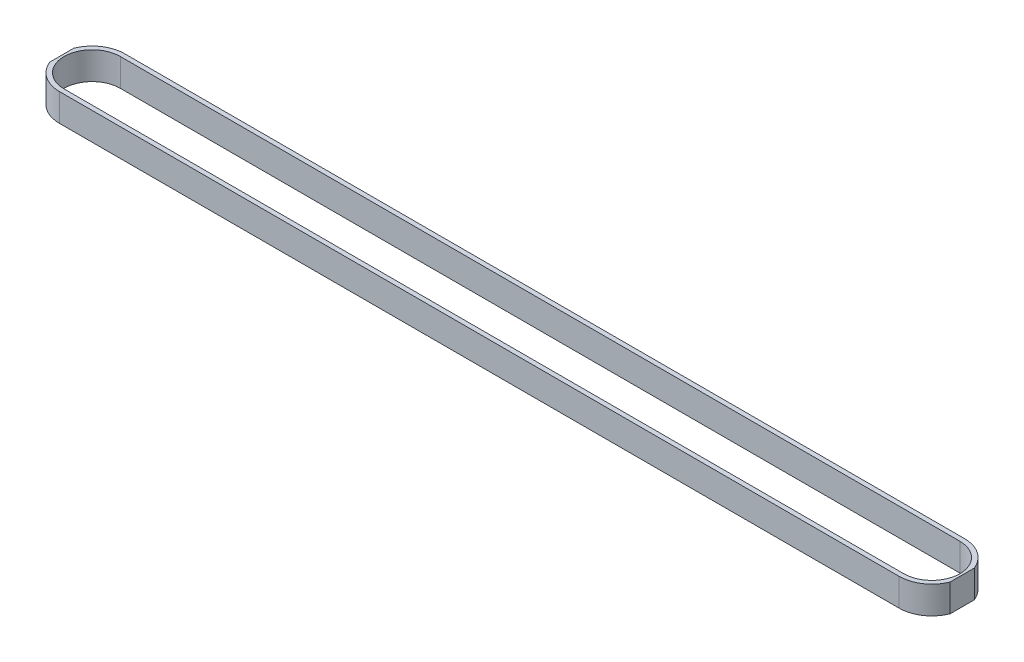
ISO-10303-21;
HEADER;
FILE_DESCRIPTION(('STEP AP214'),'2;1');
FILE_NAME('part.step','',(''),(''),'','','');
FILE_SCHEMA(('AUTOMOTIVE_DESIGN { 1 0 10303 214 1 1 1 1 }'));
ENDSEC;
DATA;
#1=APPLICATION_CONTEXT('core data for automotive mechanical design processes');
#2=APPLICATION_PROTOCOL_DEFINITION('international standard','automotive_design',2000,#1);
#3=PRODUCT_CONTEXT('',#1,'mechanical');
#4=PRODUCT('Part','Part','',(#3));
#5=PRODUCT_RELATED_PRODUCT_CATEGORY('part','',(#4));
#6=PRODUCT_DEFINITION_FORMATION('','',#4);
#7=PRODUCT_DEFINITION_CONTEXT('part definition',#1,'design');
#8=PRODUCT_DEFINITION('design','',#6,#7);
#9=PRODUCT_DEFINITION_SHAPE('','',#8);
#10=(LENGTH_UNIT() NAMED_UNIT(*) SI_UNIT(.MILLI.,.METRE.));
#11=(NAMED_UNIT(*) PLANE_ANGLE_UNIT() SI_UNIT($,.RADIAN.));
#12=(NAMED_UNIT(*) SI_UNIT($,.STERADIAN.) SOLID_ANGLE_UNIT());
#13=UNCERTAINTY_MEASURE_WITH_UNIT(LENGTH_MEASURE(1.E-05),#10,'distance_accuracy_value','');
#14=(GEOMETRIC_REPRESENTATION_CONTEXT(3) GLOBAL_UNCERTAINTY_ASSIGNED_CONTEXT((#13)) GLOBAL_UNIT_ASSIGNED_CONTEXT((#10,
#11,#12)) REPRESENTATION_CONTEXT('',''));
#15=CARTESIAN_POINT('',(0.,0.,0.));
#16=DIRECTION('',(0.,0.,1.));
#17=DIRECTION('',(1.,0.,0.));
#18=AXIS2_PLACEMENT_3D('',#15,#16,#17);
#19=CARTESIAN_POINT('',(0.,6.,0.));
#20=DIRECTION('',(0.,-1.,0.));
#21=DIRECTION('',(0.,0.,-1.));
#22=AXIS2_PLACEMENT_3D('',#19,#20,#21);
#23=CYLINDRICAL_SURFACE('',#22,7.11);
#24=CARTESIAN_POINT('',(0.,6.,0.));
#25=DIRECTION('',(0.,1.,0.));
#26=DIRECTION('',(0.,0.,1.));
#27=AXIS2_PLACEMENT_3D('',#24,#25,#26);
#28=CIRCLE('',#27,7.11);
#29=CARTESIAN_POINT('',(-6.61000000000003,6.,2.61916017074168));
#30=VERTEX_POINT('',#29);
#31=CARTESIAN_POINT('',(0.,6.,7.11));
#32=VERTEX_POINT('',#31);
#33=EDGE_CURVE('E187',#30,#32,#28,.T.);
#34=ORIENTED_EDGE('',*,*,#33,.F.);
#35=DIRECTION('',(0.,-1.,0.));
#36=VECTOR('',#35,1.);
#37=CARTESIAN_POINT('',(-6.61000000000003,6.,2.61916017074168));
#38=LINE('',#37,#36);
#39=CARTESIAN_POINT('',(-6.61000000000003,0.,2.61916017074168));
#40=VERTEX_POINT('',#39);
#41=EDGE_CURVE('E11',#30,#40,#38,.T.);
#42=ORIENTED_EDGE('',*,*,#41,.T.);
#43=CARTESIAN_POINT('',(0.,0.,0.));
#44=DIRECTION('',(0.,1.,0.));
#45=DIRECTION('',(0.,0.,1.));
#46=AXIS2_PLACEMENT_3D('',#43,#44,#45);
#47=CIRCLE('',#46,7.11);
#48=CARTESIAN_POINT('',(0.,0.,7.11));
#49=VERTEX_POINT('',#48);
#50=EDGE_CURVE('E176',#40,#49,#47,.T.);
#51=ORIENTED_EDGE('',*,*,#50,.T.);
#52=DIRECTION('',(0.,-1.,0.));
#53=VECTOR('',#52,1.);
#54=CARTESIAN_POINT('',(0.,6.,7.11));
#55=LINE('',#54,#53);
#56=EDGE_CURVE('E197',#32,#49,#55,.T.);
#57=ORIENTED_EDGE('',*,*,#56,.F.);
#58=EDGE_LOOP('',(#34,#42,#51,#57));
#59=FACE_BOUND('',#58,.T.);
#60=ADVANCED_FACE('F46',(#59),#23,.T.);
#61=CARTESIAN_POINT('',(182.64,6.,0.));
#62=DIRECTION('',(0.,-1.,0.));
#63=DIRECTION('',(0.,0.,-1.));
#64=AXIS2_PLACEMENT_3D('',#61,#62,#63);
#65=CYLINDRICAL_SURFACE('',#64,7.11);
#66=CARTESIAN_POINT('',(182.64,6.,0.));
#67=DIRECTION('',(0.,1.,0.));
#68=DIRECTION('',(0.,0.,-1.));
#69=AXIS2_PLACEMENT_3D('',#66,#67,#68);
#70=CIRCLE('',#69,7.11);
#71=CARTESIAN_POINT('',(189.25,6.,-2.61916017074168));
#72=VERTEX_POINT('',#71);
#73=CARTESIAN_POINT('',(182.64,6.,-7.11));
#74=VERTEX_POINT('',#73);
#75=EDGE_CURVE('E148',#72,#74,#70,.T.);
#76=ORIENTED_EDGE('',*,*,#75,.F.);
#77=DIRECTION('',(0.,-1.,0.));
#78=VECTOR('',#77,1.);
#79=CARTESIAN_POINT('',(189.25,6.,-2.61916017074168));
#80=LINE('',#79,#78);
#81=CARTESIAN_POINT('',(189.25,0.,-2.61916017074168));
#82=VERTEX_POINT('',#81);
#83=EDGE_CURVE('E134',#72,#82,#80,.T.);
#84=ORIENTED_EDGE('',*,*,#83,.T.);
#85=CARTESIAN_POINT('',(182.64,0.,0.));
#86=DIRECTION('',(0.,1.,0.));
#87=DIRECTION('',(0.,0.,-1.));
#88=AXIS2_PLACEMENT_3D('',#85,#86,#87);
#89=CIRCLE('',#88,7.11);
#90=CARTESIAN_POINT('',(182.64,0.,-7.11));
#91=VERTEX_POINT('',#90);
#92=EDGE_CURVE('E179',#82,#91,#89,.T.);
#93=ORIENTED_EDGE('',*,*,#92,.T.);
#94=DIRECTION('',(0.,-1.,0.));
#95=VECTOR('',#94,1.);
#96=CARTESIAN_POINT('',(182.64,6.,-7.11));
#97=LINE('',#96,#95);
#98=EDGE_CURVE('E156',#74,#91,#97,.T.);
#99=ORIENTED_EDGE('',*,*,#98,.F.);
#100=EDGE_LOOP('',(#76,#84,#93,#99));
#101=FACE_BOUND('',#100,.T.);
#102=ADVANCED_FACE('F154',(#101),#65,.T.);
#103=CARTESIAN_POINT('',(0.,6.,0.));
#104=DIRECTION('',(0.,1.,0.));
#105=DIRECTION('',(0.,0.,1.));
#106=AXIS2_PLACEMENT_3D('',#103,#104,#105);
#107=PLANE('',#106);
#108=DIRECTION('',(0.,0.,1.));
#109=VECTOR('',#108,1.);
#110=CARTESIAN_POINT('',(189.25,6.,-7.50000000000014));
#111=LINE('',#110,#109);
#112=CARTESIAN_POINT('',(189.25,6.,2.61916017074168));
#113=VERTEX_POINT('',#112);
#114=EDGE_CURVE('E70',#72,#113,#111,.T.);
#115=ORIENTED_EDGE('',*,*,#114,.F.);
#116=ORIENTED_EDGE('',*,*,#75,.T.);
#117=DIRECTION('',(-1.,0.,0.));
#118=VECTOR('',#117,1.);
#119=CARTESIAN_POINT('',(0.,6.,-7.11));
#120=LINE('',#119,#118);
#121=CARTESIAN_POINT('',(0.,6.,-7.11));
#122=VERTEX_POINT('',#121);
#123=EDGE_CURVE('E163',#74,#122,#120,.T.);
#124=ORIENTED_EDGE('',*,*,#123,.T.);
#125=CARTESIAN_POINT('',(-6.61000000000003,6.,-2.61916017074168));
#126=VERTEX_POINT('',#125);
#127=EDGE_CURVE('E164',#122,#126,#28,.T.);
#128=ORIENTED_EDGE('',*,*,#127,.T.);
#129=DIRECTION('',(0.,0.,-1.));
#130=VECTOR('',#129,1.);
#131=CARTESIAN_POINT('',(-6.61000000000003,6.,-7.50000000000014));
#132=LINE('',#131,#130);
#133=EDGE_CURVE('E62',#30,#126,#132,.T.);
#134=ORIENTED_EDGE('',*,*,#133,.F.);
#135=ORIENTED_EDGE('',*,*,#33,.T.);
#136=DIRECTION('',(1.,0.,0.));
#137=VECTOR('',#136,1.);
#138=CARTESIAN_POINT('',(0.,6.,7.11));
#139=LINE('',#138,#137);
#140=CARTESIAN_POINT('',(182.64,6.,7.11));
#141=VERTEX_POINT('',#140);
#142=EDGE_CURVE('E159',#32,#141,#139,.T.);
#143=ORIENTED_EDGE('',*,*,#142,.T.);
#144=EDGE_CURVE('E151',#141,#113,#70,.T.);
#145=ORIENTED_EDGE('',*,*,#144,.T.);
#146=EDGE_LOOP('',(#115,#116,#124,#128,#134,#135,#143,#145));
#147=FACE_BOUND('',#146,.T.);
#148=DIRECTION('',(1.,0.,0.));
#149=VECTOR('',#148,1.);
#150=CARTESIAN_POINT('',(0.,6.,6.11219772367581));
#151=LINE('',#150,#149);
#152=CARTESIAN_POINT('',(0.,6.,6.11219772367581));
#153=VERTEX_POINT('',#152);
#154=CARTESIAN_POINT('',(182.64,6.,6.11219772367581));
#155=VERTEX_POINT('',#154);
#156=EDGE_CURVE('E251',#153,#155,#151,.T.);
#157=ORIENTED_EDGE('',*,*,#156,.F.);
#158=CARTESIAN_POINT('',(0.,6.,0.));
#159=DIRECTION('',(0.,1.,0.));
#160=DIRECTION('',(0.,0.,1.));
#161=AXIS2_PLACEMENT_3D('',#158,#159,#160);
#162=CIRCLE('',#161,6.11219772367581);
#163=CARTESIAN_POINT('',(0.,6.,-6.11219772367581));
#164=VERTEX_POINT('',#163);
#165=EDGE_CURVE('E232',#164,#153,#162,.T.);
#166=ORIENTED_EDGE('',*,*,#165,.F.);
#167=DIRECTION('',(-1.,0.,0.));
#168=VECTOR('',#167,1.);
#169=CARTESIAN_POINT('',(0.,6.,-6.11219772367581));
#170=LINE('',#169,#168);
#171=CARTESIAN_POINT('',(182.64,6.,-6.11219772367581));
#172=VERTEX_POINT('',#171);
#173=EDGE_CURVE('E227',#172,#164,#170,.T.);
#174=ORIENTED_EDGE('',*,*,#173,.F.);
#175=CARTESIAN_POINT('',(182.64,6.,0.));
#176=DIRECTION('',(0.,1.,0.));
#177=DIRECTION('',(0.,0.,1.));
#178=AXIS2_PLACEMENT_3D('',#175,#176,#177);
#179=CIRCLE('',#178,6.11219772367581);
#180=EDGE_CURVE('E247',#155,#172,#179,.T.);
#181=ORIENTED_EDGE('',*,*,#180,.F.);
#182=EDGE_LOOP('',(#157,#166,#174,#181));
#183=FACE_BOUND('',#182,.T.);
#184=ADVANCED_FACE('F146',(#147,#183),#107,.T.);
#185=CARTESIAN_POINT('',(0.,0.,0.));
#186=DIRECTION('',(0.,1.,0.));
#187=DIRECTION('',(0.,0.,1.));
#188=AXIS2_PLACEMENT_3D('',#185,#186,#187);
#189=PLANE('',#188);
#190=ORIENTED_EDGE('',*,*,#92,.F.);
#191=DIRECTION('',(0.,0.,1.));
#192=VECTOR('',#191,1.);
#193=CARTESIAN_POINT('',(189.25,0.,-7.50000000000014));
#194=LINE('',#193,#192);
#195=CARTESIAN_POINT('',(189.25,0.,2.61916017074168));
#196=VERTEX_POINT('',#195);
#197=EDGE_CURVE('E137',#82,#196,#194,.T.);
#198=ORIENTED_EDGE('',*,*,#197,.T.);
#199=CARTESIAN_POINT('',(182.64,0.,7.11));
#200=VERTEX_POINT('',#199);
#201=EDGE_CURVE('E180',#200,#196,#89,.T.);
#202=ORIENTED_EDGE('',*,*,#201,.F.);
#203=DIRECTION('',(1.,0.,0.));
#204=VECTOR('',#203,1.);
#205=CARTESIAN_POINT('',(0.,0.,7.11));
#206=LINE('',#205,#204);
#207=EDGE_CURVE('E175',#49,#200,#206,.T.);
#208=ORIENTED_EDGE('',*,*,#207,.F.);
#209=ORIENTED_EDGE('',*,*,#50,.F.);
#210=DIRECTION('',(0.,0.,-1.));
#211=VECTOR('',#210,1.);
#212=CARTESIAN_POINT('',(-6.61000000000003,0.,-7.50000000000014));
#213=LINE('',#212,#211);
#214=CARTESIAN_POINT('',(-6.61000000000003,0.,-2.61916017074168));
#215=VERTEX_POINT('',#214);
#216=EDGE_CURVE('E256',#40,#215,#213,.T.);
#217=ORIENTED_EDGE('',*,*,#216,.T.);
#218=CARTESIAN_POINT('',(0.,0.,-7.11));
#219=VERTEX_POINT('',#218);
#220=EDGE_CURVE('E171',#219,#215,#47,.T.);
#221=ORIENTED_EDGE('',*,*,#220,.F.);
#222=DIRECTION('',(-1.,0.,0.));
#223=VECTOR('',#222,1.);
#224=CARTESIAN_POINT('',(0.,0.,-7.11));
#225=LINE('',#224,#223);
#226=EDGE_CURVE('E184',#91,#219,#225,.T.);
#227=ORIENTED_EDGE('',*,*,#226,.F.);
#228=EDGE_LOOP('',(#190,#198,#202,#208,#209,#217,#221,#227));
#229=FACE_BOUND('',#228,.T.);
#230=CARTESIAN_POINT('',(0.,0.,0.));
#231=DIRECTION('',(0.,1.,0.));
#232=DIRECTION('',(0.,0.,1.));
#233=AXIS2_PLACEMENT_3D('',#230,#231,#232);
#234=CIRCLE('',#233,6.11219772367581);
#235=CARTESIAN_POINT('',(0.,0.,-6.11219772367581));
#236=VERTEX_POINT('',#235);
#237=CARTESIAN_POINT('',(0.,0.,6.11219772367581));
#238=VERTEX_POINT('',#237);
#239=EDGE_CURVE('E241',#236,#238,#234,.T.);
#240=ORIENTED_EDGE('',*,*,#239,.T.);
#241=DIRECTION('',(1.,0.,0.));
#242=VECTOR('',#241,1.);
#243=CARTESIAN_POINT('',(0.,0.,6.11219772367581));
#244=LINE('',#243,#242);
#245=CARTESIAN_POINT('',(182.64,0.,6.11219772367581));
#246=VERTEX_POINT('',#245);
#247=EDGE_CURVE('E237',#238,#246,#244,.T.);
#248=ORIENTED_EDGE('',*,*,#247,.T.);
#249=CARTESIAN_POINT('',(182.64,0.,0.));
#250=DIRECTION('',(0.,1.,0.));
#251=DIRECTION('',(0.,0.,1.));
#252=AXIS2_PLACEMENT_3D('',#249,#250,#251);
#253=CIRCLE('',#252,6.11219772367581);
#254=CARTESIAN_POINT('',(182.64,0.,-6.11219772367581));
#255=VERTEX_POINT('',#254);
#256=EDGE_CURVE('E233',#246,#255,#253,.T.);
#257=ORIENTED_EDGE('',*,*,#256,.T.);
#258=DIRECTION('',(-1.,0.,0.));
#259=VECTOR('',#258,1.);
#260=CARTESIAN_POINT('',(0.,0.,-6.11219772367581));
#261=LINE('',#260,#259);
#262=EDGE_CURVE('E228',#255,#236,#261,.T.);
#263=ORIENTED_EDGE('',*,*,#262,.T.);
#264=EDGE_LOOP('',(#240,#248,#257,#263));
#265=FACE_BOUND('',#264,.T.);
#266=ADVANCED_FACE('F264',(#229,#265),#189,.F.);
#267=ORIENTED_EDGE('',*,*,#220,.T.);
#268=DIRECTION('',(0.,-1.,0.));
#269=VECTOR('',#268,1.);
#270=CARTESIAN_POINT('',(-6.61000000000003,6.,-2.61916017074168));
#271=LINE('',#270,#269);
#272=EDGE_CURVE('E55',#215,#126,#271,.F.);
#273=ORIENTED_EDGE('',*,*,#272,.T.);
#274=ORIENTED_EDGE('',*,*,#127,.F.);
#275=DIRECTION('',(0.,-1.,0.));
#276=VECTOR('',#275,1.);
#277=CARTESIAN_POINT('',(0.,6.,-7.11));
#278=LINE('',#277,#276);
#279=EDGE_CURVE('E170',#122,#219,#278,.T.);
#280=ORIENTED_EDGE('',*,*,#279,.T.);
#281=EDGE_LOOP('',(#267,#273,#274,#280));
#282=FACE_BOUND('',#281,.T.);
#283=ADVANCED_FACE('F48',(#282),#23,.T.);
#284=CARTESIAN_POINT('',(0.,6.,7.11));
#285=DIRECTION('',(0.,0.,-1.));
#286=DIRECTION('',(-1.,0.,0.));
#287=AXIS2_PLACEMENT_3D('',#284,#285,#286);
#288=PLANE('',#287);
#289=ORIENTED_EDGE('',*,*,#207,.T.);
#290=DIRECTION('',(0.,-1.,0.));
#291=VECTOR('',#290,1.);
#292=CARTESIAN_POINT('',(182.64,6.,7.11));
#293=LINE('',#292,#291);
#294=EDGE_CURVE('E193',#141,#200,#293,.T.);
#295=ORIENTED_EDGE('',*,*,#294,.F.);
#296=ORIENTED_EDGE('',*,*,#142,.F.);
#297=ORIENTED_EDGE('',*,*,#56,.T.);
#298=EDGE_LOOP('',(#289,#295,#296,#297));
#299=FACE_BOUND('',#298,.T.);
#300=ADVANCED_FACE('F273',(#299),#288,.F.);
#301=ORIENTED_EDGE('',*,*,#201,.T.);
#302=DIRECTION('',(0.,-1.,0.));
#303=VECTOR('',#302,1.);
#304=CARTESIAN_POINT('',(189.25,6.,2.61916017074168));
#305=LINE('',#304,#303);
#306=EDGE_CURVE('E142',#196,#113,#305,.F.);
#307=ORIENTED_EDGE('',*,*,#306,.T.);
#308=ORIENTED_EDGE('',*,*,#144,.F.);
#309=ORIENTED_EDGE('',*,*,#294,.T.);
#310=EDGE_LOOP('',(#301,#307,#308,#309));
#311=FACE_BOUND('',#310,.T.);
#312=ADVANCED_FACE('F269',(#311),#65,.T.);
#313=CARTESIAN_POINT('',(0.,6.,-7.11));
#314=DIRECTION('',(0.,0.,1.));
#315=DIRECTION('',(1.,0.,0.));
#316=AXIS2_PLACEMENT_3D('',#313,#314,#315);
#317=PLANE('',#316);
#318=ORIENTED_EDGE('',*,*,#226,.T.);
#319=ORIENTED_EDGE('',*,*,#279,.F.);
#320=ORIENTED_EDGE('',*,*,#123,.F.);
#321=ORIENTED_EDGE('',*,*,#98,.T.);
#322=EDGE_LOOP('',(#318,#319,#320,#321));
#323=FACE_BOUND('',#322,.T.);
#324=ADVANCED_FACE('F280',(#323),#317,.F.);
#325=CARTESIAN_POINT('',(0.,6.,0.));
#326=DIRECTION('',(0.,-1.,0.));
#327=DIRECTION('',(0.,0.,-1.));
#328=AXIS2_PLACEMENT_3D('',#325,#326,#327);
#329=CYLINDRICAL_SURFACE('',#328,6.11219772367581);
#330=ORIENTED_EDGE('',*,*,#239,.F.);
#331=DIRECTION('',(0.,-1.,0.));
#332=VECTOR('',#331,1.);
#333=CARTESIAN_POINT('',(0.,6.,-6.11219772367581));
#334=LINE('',#333,#332);
#335=EDGE_CURVE('E223',#164,#236,#334,.T.);
#336=ORIENTED_EDGE('',*,*,#335,.F.);
#337=ORIENTED_EDGE('',*,*,#165,.T.);
#338=DIRECTION('',(0.,-1.,0.));
#339=VECTOR('',#338,1.);
#340=CARTESIAN_POINT('',(0.,6.,6.11219772367581));
#341=LINE('',#340,#339);
#342=EDGE_CURVE('E213',#153,#238,#341,.T.);
#343=ORIENTED_EDGE('',*,*,#342,.T.);
#344=EDGE_LOOP('',(#330,#336,#337,#343));
#345=FACE_BOUND('',#344,.T.);
#346=ADVANCED_FACE('F282',(#345),#329,.F.);
#347=CARTESIAN_POINT('',(0.,6.,6.11219772367581));
#348=DIRECTION('',(0.,0.,-1.));
#349=DIRECTION('',(-1.,0.,0.));
#350=AXIS2_PLACEMENT_3D('',#347,#348,#349);
#351=PLANE('',#350);
#352=ORIENTED_EDGE('',*,*,#247,.F.);
#353=ORIENTED_EDGE('',*,*,#342,.F.);
#354=ORIENTED_EDGE('',*,*,#156,.T.);
#355=DIRECTION('',(0.,-1.,0.));
#356=VECTOR('',#355,1.);
#357=CARTESIAN_POINT('',(182.64,6.,6.11219772367581));
#358=LINE('',#357,#356);
#359=EDGE_CURVE('E217',#155,#246,#358,.T.);
#360=ORIENTED_EDGE('',*,*,#359,.T.);
#361=EDGE_LOOP('',(#352,#353,#354,#360));
#362=FACE_BOUND('',#361,.T.);
#363=ADVANCED_FACE('F288',(#362),#351,.T.);
#364=CARTESIAN_POINT('',(182.64,6.,0.));
#365=DIRECTION('',(0.,-1.,0.));
#366=DIRECTION('',(0.,0.,-1.));
#367=AXIS2_PLACEMENT_3D('',#364,#365,#366);
#368=CYLINDRICAL_SURFACE('',#367,6.11219772367581);
#369=ORIENTED_EDGE('',*,*,#256,.F.);
#370=ORIENTED_EDGE('',*,*,#359,.F.);
#371=ORIENTED_EDGE('',*,*,#180,.T.);
#372=DIRECTION('',(0.,-1.,0.));
#373=VECTOR('',#372,1.);
#374=CARTESIAN_POINT('',(182.64,6.,-6.11219772367581));
#375=LINE('',#374,#373);
#376=EDGE_CURVE('E220',#172,#255,#375,.T.);
#377=ORIENTED_EDGE('',*,*,#376,.T.);
#378=EDGE_LOOP('',(#369,#370,#371,#377));
#379=FACE_BOUND('',#378,.T.);
#380=ADVANCED_FACE('F310',(#379),#368,.F.);
#381=CARTESIAN_POINT('',(0.,6.,-6.11219772367581));
#382=DIRECTION('',(0.,0.,1.));
#383=DIRECTION('',(1.,0.,0.));
#384=AXIS2_PLACEMENT_3D('',#381,#382,#383);
#385=PLANE('',#384);
#386=ORIENTED_EDGE('',*,*,#262,.F.);
#387=ORIENTED_EDGE('',*,*,#376,.F.);
#388=ORIENTED_EDGE('',*,*,#173,.T.);
#389=ORIENTED_EDGE('',*,*,#335,.T.);
#390=EDGE_LOOP('',(#386,#387,#388,#389));
#391=FACE_BOUND('',#390,.T.);
#392=ADVANCED_FACE('F314',(#391),#385,.T.);
#393=CARTESIAN_POINT('',(189.25,0.,-7.50000000000014));
#394=DIRECTION('',(-1.,0.,0.));
#395=DIRECTION('',(0.,0.,1.));
#396=AXIS2_PLACEMENT_3D('',#393,#394,#395);
#397=PLANE('',#396);
#398=ORIENTED_EDGE('',*,*,#114,.T.);
#399=ORIENTED_EDGE('',*,*,#306,.F.);
#400=ORIENTED_EDGE('',*,*,#197,.F.);
#401=ORIENTED_EDGE('',*,*,#83,.F.);
#402=EDGE_LOOP('',(#398,#399,#400,#401));
#403=FACE_BOUND('',#402,.T.);
#404=ADVANCED_FACE('F135',(#403),#397,.F.);
#405=CARTESIAN_POINT('',(-6.61000000000003,0.,-7.50000000000014));
#406=DIRECTION('',(1.,0.,0.));
#407=DIRECTION('',(0.,0.,-1.));
#408=AXIS2_PLACEMENT_3D('',#405,#406,#407);
#409=PLANE('',#408);
#410=ORIENTED_EDGE('',*,*,#133,.T.);
#411=ORIENTED_EDGE('',*,*,#272,.F.);
#412=ORIENTED_EDGE('',*,*,#216,.F.);
#413=ORIENTED_EDGE('',*,*,#41,.F.);
#414=EDGE_LOOP('',(#410,#411,#412,#413));
#415=FACE_BOUND('',#414,.T.);
#416=ADVANCED_FACE('F318',(#415),#409,.F.);
#417=CLOSED_SHELL('',(#60,#102,#184,#266,#283,#300,#312,#324,#346,#363,#380,#392,#404,#416));
#418=MANIFOLD_SOLID_BREP('B2',#417);
#419=ADVANCED_BREP_SHAPE_REPRESENTATION('',(#18,#418),#14);
#420=SHAPE_DEFINITION_REPRESENTATION(#9,#419);
ENDSEC;
END-ISO-10303-21;
